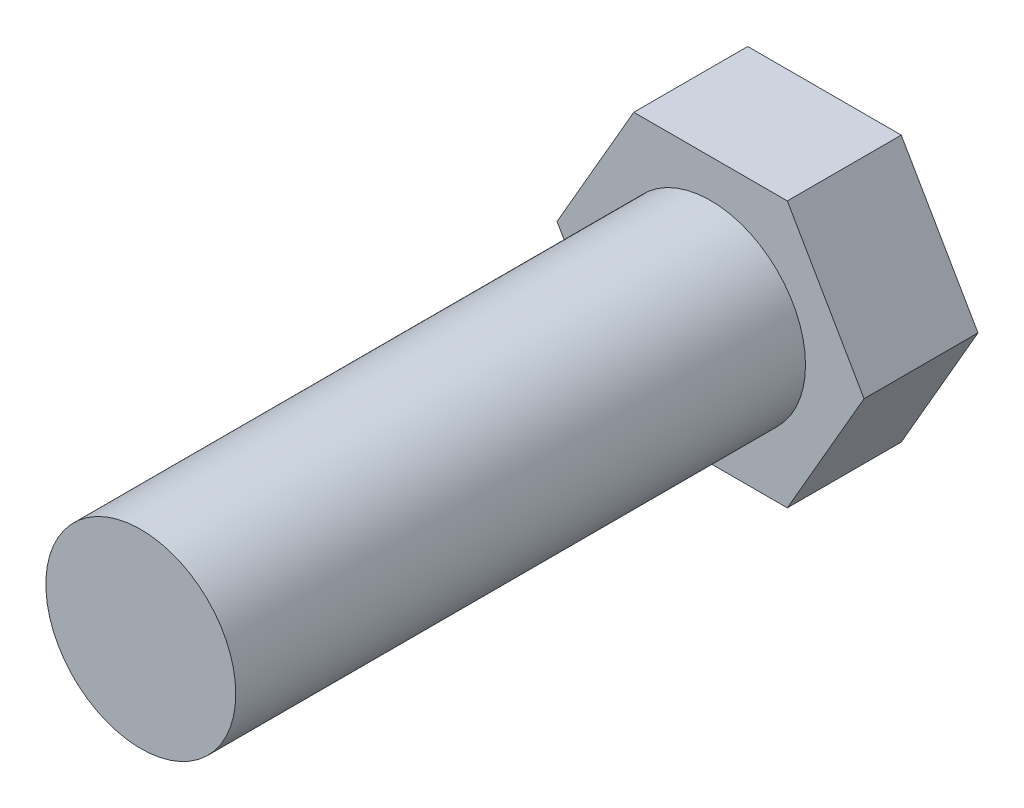
ISO-10303-21;
HEADER;
FILE_DESCRIPTION(('STEP AP214'),'2;1');
FILE_NAME('part.step','',(''),(''),'','','');
FILE_SCHEMA(('AUTOMOTIVE_DESIGN { 1 0 10303 214 1 1 1 1 }'));
ENDSEC;
DATA;
#1=APPLICATION_CONTEXT('core data for automotive mechanical design processes');
#2=APPLICATION_PROTOCOL_DEFINITION('international standard','automotive_design',2000,#1);
#3=PRODUCT_CONTEXT('',#1,'mechanical');
#4=PRODUCT('Part','Part','',(#3));
#5=PRODUCT_RELATED_PRODUCT_CATEGORY('part','',(#4));
#6=PRODUCT_DEFINITION_FORMATION('','',#4);
#7=PRODUCT_DEFINITION_CONTEXT('part definition',#1,'design');
#8=PRODUCT_DEFINITION('design','',#6,#7);
#9=PRODUCT_DEFINITION_SHAPE('','',#8);
#10=(LENGTH_UNIT() NAMED_UNIT(*) SI_UNIT(.MILLI.,.METRE.));
#11=(NAMED_UNIT(*) PLANE_ANGLE_UNIT() SI_UNIT($,.RADIAN.));
#12=(NAMED_UNIT(*) SI_UNIT($,.STERADIAN.) SOLID_ANGLE_UNIT());
#13=UNCERTAINTY_MEASURE_WITH_UNIT(LENGTH_MEASURE(1.E-05),#10,'distance_accuracy_value','');
#14=(GEOMETRIC_REPRESENTATION_CONTEXT(3) GLOBAL_UNCERTAINTY_ASSIGNED_CONTEXT((#13)) GLOBAL_UNIT_ASSIGNED_CONTEXT((#10,
#11,#12)) REPRESENTATION_CONTEXT('',''));
#15=CARTESIAN_POINT('',(0.,0.,0.));
#16=DIRECTION('',(0.,0.,1.));
#17=DIRECTION('',(1.,0.,0.));
#18=AXIS2_PLACEMENT_3D('',#15,#16,#17);
#19=CARTESIAN_POINT('',(4.04145188432737,0.,3.));
#20=DIRECTION('',(-0.866025403784438,-0.500000000000001,0.));
#21=DIRECTION('',(0.500000000000001,-0.866025403784438,0.));
#22=AXIS2_PLACEMENT_3D('',#19,#20,#21);
#23=PLANE('',#22);
#24=DIRECTION('',(-0.500000000000001,0.866025403784438,0.));
#25=VECTOR('',#24,1.);
#26=CARTESIAN_POINT('',(4.04145188432737,0.,0.));
#27=LINE('',#26,#25);
#28=CARTESIAN_POINT('',(4.04145188432737,0.,0.));
#29=VERTEX_POINT('',#28);
#30=CARTESIAN_POINT('',(2.02072594216368,3.49999999999999,0.));
#31=VERTEX_POINT('',#30);
#32=EDGE_CURVE('E130',#29,#31,#27,.T.);
#33=ORIENTED_EDGE('',*,*,#32,.T.);
#34=DIRECTION('',(0.,0.,-1.));
#35=VECTOR('',#34,1.);
#36=CARTESIAN_POINT('',(2.02072594216368,3.49999999999999,3.));
#37=LINE('',#36,#35);
#38=CARTESIAN_POINT('',(2.02072594216368,3.49999999999999,3.));
#39=VERTEX_POINT('',#38);
#40=EDGE_CURVE('E42',#39,#31,#37,.T.);
#41=ORIENTED_EDGE('',*,*,#40,.F.);
#42=DIRECTION('',(-0.500000000000001,0.866025403784438,0.));
#43=VECTOR('',#42,1.);
#44=CARTESIAN_POINT('',(4.04145188432737,0.,3.));
#45=LINE('',#44,#43);
#46=CARTESIAN_POINT('',(4.04145188432737,0.,3.));
#47=VERTEX_POINT('',#46);
#48=EDGE_CURVE('E147',#47,#39,#45,.T.);
#49=ORIENTED_EDGE('',*,*,#48,.F.);
#50=DIRECTION('',(0.,0.,-1.));
#51=VECTOR('',#50,1.);
#52=CARTESIAN_POINT('',(4.04145188432737,0.,3.));
#53=LINE('',#52,#51);
#54=EDGE_CURVE('E126',#47,#29,#53,.T.);
#55=ORIENTED_EDGE('',*,*,#54,.T.);
#56=EDGE_LOOP('',(#33,#41,#49,#55));
#57=FACE_BOUND('',#56,.T.);
#58=ADVANCED_FACE('F39',(#57),#23,.F.);
#59=CARTESIAN_POINT('',(2.02072594216368,3.49999999999999,3.));
#60=DIRECTION('',(0.,-1.,0.));
#61=DIRECTION('',(1.,0.,0.));
#62=AXIS2_PLACEMENT_3D('',#59,#60,#61);
#63=PLANE('',#62);
#64=DIRECTION('',(-1.,0.,0.));
#65=VECTOR('',#64,1.);
#66=CARTESIAN_POINT('',(2.02072594216368,3.49999999999999,0.));
#67=LINE('',#66,#65);
#68=CARTESIAN_POINT('',(-2.0207259421637,3.49999999999998,0.));
#69=VERTEX_POINT('',#68);
#70=EDGE_CURVE('E134',#31,#69,#67,.T.);
#71=ORIENTED_EDGE('',*,*,#70,.T.);
#72=DIRECTION('',(0.,0.,-1.));
#73=VECTOR('',#72,1.);
#74=CARTESIAN_POINT('',(-2.0207259421637,3.49999999999998,3.));
#75=LINE('',#74,#73);
#76=CARTESIAN_POINT('',(-2.0207259421637,3.49999999999998,3.));
#77=VERTEX_POINT('',#76);
#78=EDGE_CURVE('E153',#77,#69,#75,.T.);
#79=ORIENTED_EDGE('',*,*,#78,.F.);
#80=DIRECTION('',(-1.,0.,0.));
#81=VECTOR('',#80,1.);
#82=CARTESIAN_POINT('',(2.02072594216368,3.49999999999999,3.));
#83=LINE('',#82,#81);
#84=EDGE_CURVE('E95',#39,#77,#83,.T.);
#85=ORIENTED_EDGE('',*,*,#84,.F.);
#86=ORIENTED_EDGE('',*,*,#40,.T.);
#87=EDGE_LOOP('',(#71,#79,#85,#86));
#88=FACE_BOUND('',#87,.T.);
#89=ADVANCED_FACE('F160',(#88),#63,.F.);
#90=CARTESIAN_POINT('',(-2.0207259421637,3.49999999999998,3.));
#91=DIRECTION('',(0.866025403784441,-0.499999999999995,0.));
#92=DIRECTION('',(0.499999999999995,0.866025403784442,0.));
#93=AXIS2_PLACEMENT_3D('',#90,#91,#92);
#94=PLANE('',#93);
#95=DIRECTION('',(-0.499999999999995,-0.866025403784442,0.));
#96=VECTOR('',#95,1.);
#97=CARTESIAN_POINT('',(-2.0207259421637,3.49999999999998,0.));
#98=LINE('',#97,#96);
#99=CARTESIAN_POINT('',(-4.04145188432737,0.,0.));
#100=VERTEX_POINT('',#99);
#101=EDGE_CURVE('E138',#69,#100,#98,.T.);
#102=ORIENTED_EDGE('',*,*,#101,.T.);
#103=DIRECTION('',(0.,0.,-1.));
#104=VECTOR('',#103,1.);
#105=CARTESIAN_POINT('',(-4.04145188432737,0.,3.));
#106=LINE('',#105,#104);
#107=CARTESIAN_POINT('',(-4.04145188432737,0.,3.));
#108=VERTEX_POINT('',#107);
#109=EDGE_CURVE('E119',#108,#100,#106,.T.);
#110=ORIENTED_EDGE('',*,*,#109,.F.);
#111=DIRECTION('',(-0.499999999999995,-0.866025403784442,0.));
#112=VECTOR('',#111,1.);
#113=CARTESIAN_POINT('',(-2.0207259421637,3.49999999999998,3.));
#114=LINE('',#113,#112);
#115=EDGE_CURVE('E108',#77,#108,#114,.T.);
#116=ORIENTED_EDGE('',*,*,#115,.F.);
#117=ORIENTED_EDGE('',*,*,#78,.T.);
#118=EDGE_LOOP('',(#102,#110,#116,#117));
#119=FACE_BOUND('',#118,.T.);
#120=ADVANCED_FACE('F166',(#119),#94,.F.);
#121=CARTESIAN_POINT('',(-4.04145188432737,0.,3.));
#122=DIRECTION('',(0.866025403784435,0.500000000000007,0.));
#123=DIRECTION('',(-0.500000000000007,0.866025403784434,0.));
#124=AXIS2_PLACEMENT_3D('',#121,#122,#123);
#125=PLANE('',#124);
#126=DIRECTION('',(0.500000000000007,-0.866025403784435,0.));
#127=VECTOR('',#126,1.);
#128=CARTESIAN_POINT('',(-4.04145188432737,0.,0.));
#129=LINE('',#128,#127);
#130=CARTESIAN_POINT('',(-2.02072594216365,-3.50000000000001,0.));
#131=VERTEX_POINT('',#130);
#132=EDGE_CURVE('E117',#100,#131,#129,.T.);
#133=ORIENTED_EDGE('',*,*,#132,.T.);
#134=DIRECTION('',(0.,0.,-1.));
#135=VECTOR('',#134,1.);
#136=CARTESIAN_POINT('',(-2.02072594216365,-3.50000000000001,3.));
#137=LINE('',#136,#135);
#138=CARTESIAN_POINT('',(-2.02072594216365,-3.50000000000001,3.));
#139=VERTEX_POINT('',#138);
#140=EDGE_CURVE('E114',#139,#131,#137,.T.);
#141=ORIENTED_EDGE('',*,*,#140,.F.);
#142=DIRECTION('',(0.500000000000007,-0.866025403784435,0.));
#143=VECTOR('',#142,1.);
#144=CARTESIAN_POINT('',(-4.04145188432737,0.,3.));
#145=LINE('',#144,#143);
#146=EDGE_CURVE('E102',#108,#139,#145,.T.);
#147=ORIENTED_EDGE('',*,*,#146,.F.);
#148=ORIENTED_EDGE('',*,*,#109,.T.);
#149=EDGE_LOOP('',(#133,#141,#147,#148));
#150=FACE_BOUND('',#149,.T.);
#151=ADVANCED_FACE('F115',(#150),#125,.F.);
#152=CARTESIAN_POINT('',(-2.02072594216365,-3.50000000000001,3.));
#153=DIRECTION('',(0.,1.,0.));
#154=DIRECTION('',(-1.,0.,0.));
#155=AXIS2_PLACEMENT_3D('',#152,#153,#154);
#156=PLANE('',#155);
#157=DIRECTION('',(1.,0.,0.));
#158=VECTOR('',#157,1.);
#159=CARTESIAN_POINT('',(-2.02072594216365,-3.50000000000001,0.));
#160=LINE('',#159,#158);
#161=CARTESIAN_POINT('',(2.02072594216372,-3.49999999999996,0.));
#162=VERTEX_POINT('',#161);
#163=EDGE_CURVE('E80',#131,#162,#160,.T.);
#164=ORIENTED_EDGE('',*,*,#163,.T.);
#165=DIRECTION('',(0.,0.,-1.));
#166=VECTOR('',#165,1.);
#167=CARTESIAN_POINT('',(2.02072594216372,-3.49999999999996,3.));
#168=LINE('',#167,#166);
#169=CARTESIAN_POINT('',(2.02072594216372,-3.49999999999996,3.));
#170=VERTEX_POINT('',#169);
#171=EDGE_CURVE('E120',#170,#162,#168,.T.);
#172=ORIENTED_EDGE('',*,*,#171,.F.);
#173=DIRECTION('',(1.,0.,0.));
#174=VECTOR('',#173,1.);
#175=CARTESIAN_POINT('',(-2.02072594216365,-3.50000000000001,3.));
#176=LINE('',#175,#174);
#177=EDGE_CURVE('E106',#139,#170,#176,.T.);
#178=ORIENTED_EDGE('',*,*,#177,.F.);
#179=ORIENTED_EDGE('',*,*,#140,.T.);
#180=EDGE_LOOP('',(#164,#172,#178,#179));
#181=FACE_BOUND('',#180,.T.);
#182=ADVANCED_FACE('F122',(#181),#156,.F.);
#183=CARTESIAN_POINT('',(2.02072594216372,-3.49999999999996,3.));
#184=DIRECTION('',(-0.866025403784441,0.499999999999995,0.));
#185=DIRECTION('',(-0.499999999999995,-0.866025403784442,0.));
#186=AXIS2_PLACEMENT_3D('',#183,#184,#185);
#187=PLANE('',#186);
#188=DIRECTION('',(0.499999999999995,0.866025403784442,0.));
#189=VECTOR('',#188,1.);
#190=CARTESIAN_POINT('',(2.02072594216372,-3.49999999999996,0.));
#191=LINE('',#190,#189);
#192=EDGE_CURVE('E86',#162,#29,#191,.T.);
#193=ORIENTED_EDGE('',*,*,#192,.T.);
#194=ORIENTED_EDGE('',*,*,#54,.F.);
#195=DIRECTION('',(0.499999999999995,0.866025403784442,0.));
#196=VECTOR('',#195,1.);
#197=CARTESIAN_POINT('',(2.02072594216372,-3.49999999999996,3.));
#198=LINE('',#197,#196);
#199=EDGE_CURVE('E57',#170,#47,#198,.T.);
#200=ORIENTED_EDGE('',*,*,#199,.F.);
#201=ORIENTED_EDGE('',*,*,#171,.T.);
#202=EDGE_LOOP('',(#193,#194,#200,#201));
#203=FACE_BOUND('',#202,.T.);
#204=ADVANCED_FACE('F186',(#203),#187,.F.);
#205=CARTESIAN_POINT('',(0.,0.,3.));
#206=DIRECTION('',(0.,0.,1.));
#207=DIRECTION('',(1.,0.,0.));
#208=AXIS2_PLACEMENT_3D('',#205,#206,#207);
#209=PLANE('',#208);
#210=CARTESIAN_POINT('',(0.,0.,3.));
#211=DIRECTION('',(0.,0.,1.));
#212=DIRECTION('',(1.,0.,0.));
#213=AXIS2_PLACEMENT_3D('',#210,#211,#212);
#214=CIRCLE('',#213,2.5);
#215=CARTESIAN_POINT('',(2.5,0.,3.));
#216=VERTEX_POINT('',#215);
#217=EDGE_CURVE('E11',#216,#216,#214,.T.);
#218=ORIENTED_EDGE('',*,*,#217,.F.);
#219=EDGE_LOOP('',(#218));
#220=FACE_BOUND('',#219,.T.);
#221=ORIENTED_EDGE('',*,*,#48,.T.);
#222=ORIENTED_EDGE('',*,*,#84,.T.);
#223=ORIENTED_EDGE('',*,*,#115,.T.);
#224=ORIENTED_EDGE('',*,*,#146,.T.);
#225=ORIENTED_EDGE('',*,*,#177,.T.);
#226=ORIENTED_EDGE('',*,*,#199,.T.);
#227=EDGE_LOOP('',(#221,#222,#223,#224,#225,#226));
#228=FACE_BOUND('',#227,.T.);
#229=ADVANCED_FACE('F104',(#220,#228),#209,.T.);
#230=CARTESIAN_POINT('',(0.,0.,0.));
#231=DIRECTION('',(0.,0.,1.));
#232=DIRECTION('',(1.,0.,0.));
#233=AXIS2_PLACEMENT_3D('',#230,#231,#232);
#234=PLANE('',#233);
#235=ORIENTED_EDGE('',*,*,#32,.F.);
#236=ORIENTED_EDGE('',*,*,#192,.F.);
#237=ORIENTED_EDGE('',*,*,#163,.F.);
#238=ORIENTED_EDGE('',*,*,#132,.F.);
#239=ORIENTED_EDGE('',*,*,#101,.F.);
#240=ORIENTED_EDGE('',*,*,#70,.F.);
#241=EDGE_LOOP('',(#235,#236,#237,#238,#239,#240));
#242=FACE_BOUND('',#241,.T.);
#243=ADVANCED_FACE('F165',(#242),#234,.F.);
#244=CARTESIAN_POINT('',(0.,0.,18.));
#245=DIRECTION('',(0.,0.,-1.));
#246=DIRECTION('',(-1.,0.,0.));
#247=AXIS2_PLACEMENT_3D('',#244,#245,#246);
#248=CYLINDRICAL_SURFACE('',#247,2.5);
#249=CARTESIAN_POINT('',(0.,0.,18.));
#250=DIRECTION('',(0.,0.,1.));
#251=DIRECTION('',(1.,0.,0.));
#252=AXIS2_PLACEMENT_3D('',#249,#250,#251);
#253=CIRCLE('',#252,2.5);
#254=CARTESIAN_POINT('',(2.5,0.,18.));
#255=VERTEX_POINT('',#254);
#256=EDGE_CURVE('E135',#255,#255,#253,.T.);
#257=ORIENTED_EDGE('',*,*,#256,.F.);
#258=EDGE_LOOP('',(#257));
#259=FACE_BOUND('',#258,.T.);
#260=ORIENTED_EDGE('',*,*,#217,.T.);
#261=EDGE_LOOP('',(#260));
#262=FACE_BOUND('',#261,.T.);
#263=ADVANCED_FACE('F179',(#259,#262),#248,.T.);
#264=CARTESIAN_POINT('',(0.,0.,18.));
#265=DIRECTION('',(0.,0.,1.));
#266=DIRECTION('',(1.,0.,0.));
#267=AXIS2_PLACEMENT_3D('',#264,#265,#266);
#268=PLANE('',#267);
#269=ORIENTED_EDGE('',*,*,#256,.T.);
#270=EDGE_LOOP('',(#269));
#271=FACE_BOUND('',#270,.T.);
#272=ADVANCED_FACE('F177',(#271),#268,.T.);
#273=CLOSED_SHELL('',(#58,#89,#120,#151,#182,#204,#229,#243,#263,#272));
#274=MANIFOLD_SOLID_BREP('B2',#273);
#275=ADVANCED_BREP_SHAPE_REPRESENTATION('',(#18,#274),#14);
#276=SHAPE_DEFINITION_REPRESENTATION(#9,#275);
ENDSEC;
END-ISO-10303-21;
